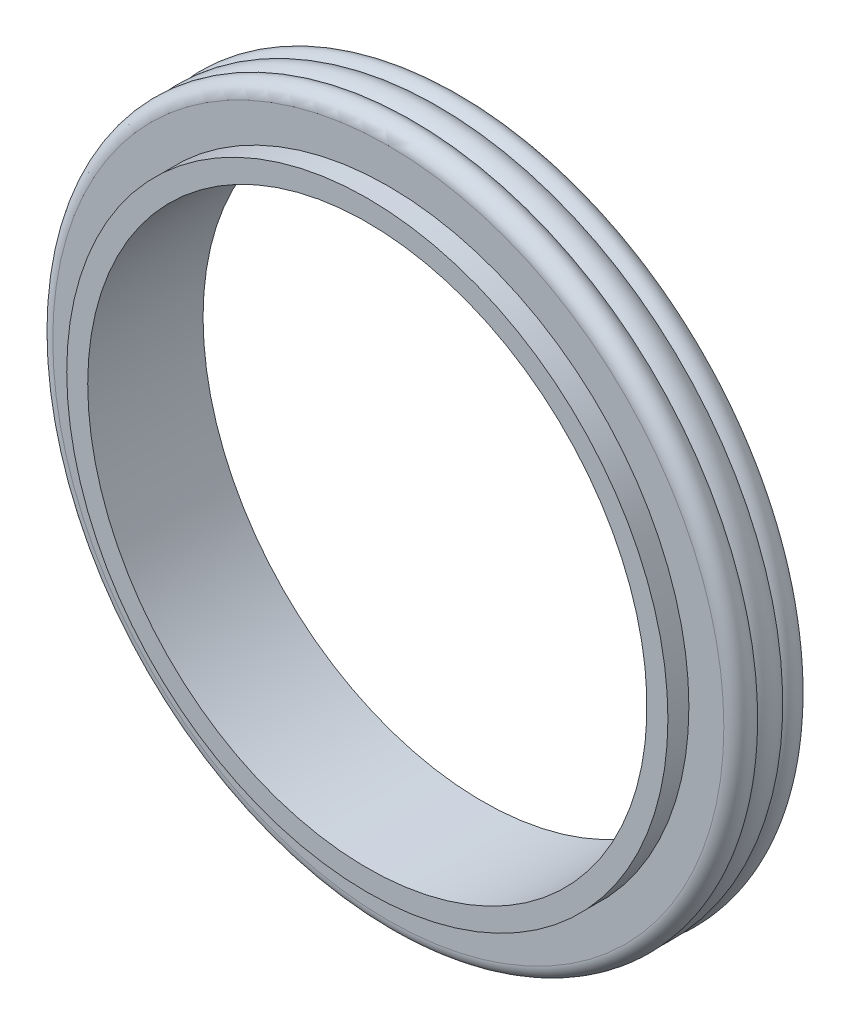
ISO-10303-21;
HEADER;
FILE_DESCRIPTION(('STEP AP214'),'2;1');
FILE_NAME('part.step','',(''),(''),'','','');
FILE_SCHEMA(('AUTOMOTIVE_DESIGN { 1 0 10303 214 1 1 1 1 }'));
ENDSEC;
DATA;
#1=APPLICATION_CONTEXT('core data for automotive mechanical design processes');
#2=APPLICATION_PROTOCOL_DEFINITION('international standard','automotive_design',2000,#1);
#3=PRODUCT_CONTEXT('',#1,'mechanical');
#4=PRODUCT('Part','Part','',(#3));
#5=PRODUCT_RELATED_PRODUCT_CATEGORY('part','',(#4));
#6=PRODUCT_DEFINITION_FORMATION('','',#4);
#7=PRODUCT_DEFINITION_CONTEXT('part definition',#1,'design');
#8=PRODUCT_DEFINITION('design','',#6,#7);
#9=PRODUCT_DEFINITION_SHAPE('','',#8);
#10=(LENGTH_UNIT() NAMED_UNIT(*) SI_UNIT(.MILLI.,.METRE.));
#11=(NAMED_UNIT(*) PLANE_ANGLE_UNIT() SI_UNIT($,.RADIAN.));
#12=(NAMED_UNIT(*) SI_UNIT($,.STERADIAN.) SOLID_ANGLE_UNIT());
#13=UNCERTAINTY_MEASURE_WITH_UNIT(LENGTH_MEASURE(1.E-05),#10,'distance_accuracy_value','');
#14=(GEOMETRIC_REPRESENTATION_CONTEXT(3) GLOBAL_UNCERTAINTY_ASSIGNED_CONTEXT((#13)) GLOBAL_UNIT_ASSIGNED_CONTEXT((#10,
#11,#12)) REPRESENTATION_CONTEXT('',''));
#15=CARTESIAN_POINT('',(0.,0.,0.));
#16=DIRECTION('',(0.,0.,1.));
#17=DIRECTION('',(1.,0.,0.));
#18=AXIS2_PLACEMENT_3D('',#15,#16,#17);
#19=CARTESIAN_POINT('',(0.,40.,8.25));
#20=DIRECTION('',(0.,0.,1.));
#21=DIRECTION('',(1.,0.,0.));
#22=AXIS2_PLACEMENT_3D('',#19,#20,#21);
#23=PLANE('',#22);
#24=CARTESIAN_POINT('',(0.,0.,8.25));
#25=DIRECTION('',(0.,0.,-1.));
#26=DIRECTION('',(-1.,0.,0.));
#27=AXIS2_PLACEMENT_3D('',#24,#25,#26);
#28=CIRCLE('',#27,40.);
#29=CARTESIAN_POINT('',(-40.,0.,8.25));
#30=VERTEX_POINT('',#29);
#31=EDGE_CURVE('E86',#30,#30,#28,.T.);
#32=ORIENTED_EDGE('',*,*,#31,.T.);
#33=EDGE_LOOP('',(#32));
#34=FACE_BOUND('',#33,.T.);
#35=CARTESIAN_POINT('',(0.,0.,8.25));
#36=DIRECTION('',(0.,0.,-1.));
#37=DIRECTION('',(-1.,0.,0.));
#38=AXIS2_PLACEMENT_3D('',#35,#36,#37);
#39=CIRCLE('',#38,43.);
#40=CARTESIAN_POINT('',(-43.,0.,8.25));
#41=VERTEX_POINT('',#40);
#42=EDGE_CURVE('E10',#41,#41,#39,.T.);
#43=ORIENTED_EDGE('',*,*,#42,.F.);
#44=EDGE_LOOP('',(#43));
#45=FACE_BOUND('',#44,.T.);
#46=ADVANCED_FACE('F43',(#34,#45),#23,.T.);
#47=CARTESIAN_POINT('',(0.,0.,0.));
#48=DIRECTION('',(0.,0.,-1.));
#49=DIRECTION('',(-1.,0.,0.));
#50=AXIS2_PLACEMENT_3D('',#47,#48,#49);
#51=CYLINDRICAL_SURFACE('',#50,43.);
#52=ORIENTED_EDGE('',*,*,#42,.T.);
#53=EDGE_LOOP('',(#52));
#54=FACE_BOUND('',#53,.T.);
#55=CARTESIAN_POINT('',(0.,0.,5.25));
#56=DIRECTION('',(0.,0.,-1.));
#57=DIRECTION('',(-1.,0.,0.));
#58=AXIS2_PLACEMENT_3D('',#55,#56,#57);
#59=CIRCLE('',#58,43.);
#60=CARTESIAN_POINT('',(-43.,0.,5.25));
#61=VERTEX_POINT('',#60);
#62=EDGE_CURVE('E50',#61,#61,#59,.T.);
#63=ORIENTED_EDGE('',*,*,#62,.F.);
#64=EDGE_LOOP('',(#63));
#65=FACE_BOUND('',#64,.T.);
#66=ADVANCED_FACE('F105',(#54,#65),#51,.T.);
#67=CARTESIAN_POINT('',(0.,43.,5.25));
#68=DIRECTION('',(0.,0.,1.));
#69=DIRECTION('',(1.,0.,0.));
#70=AXIS2_PLACEMENT_3D('',#67,#68,#69);
#71=PLANE('',#70);
#72=ORIENTED_EDGE('',*,*,#62,.T.);
#73=EDGE_LOOP('',(#72));
#74=FACE_BOUND('',#73,.T.);
#75=CARTESIAN_POINT('',(0.,0.,5.25));
#76=DIRECTION('',(0.,0.,-1.));
#77=DIRECTION('',(-1.,0.,0.));
#78=AXIS2_PLACEMENT_3D('',#75,#76,#77);
#79=CIRCLE('',#78,48.);
#80=CARTESIAN_POINT('',(-48.,0.,5.25));
#81=VERTEX_POINT('',#80);
#82=EDGE_CURVE('E55',#81,#81,#79,.T.);
#83=ORIENTED_EDGE('',*,*,#82,.F.);
#84=EDGE_LOOP('',(#83));
#85=FACE_BOUND('',#84,.T.);
#86=ADVANCED_FACE('F109',(#74,#85),#71,.T.);
#87=CARTESIAN_POINT('',(0.,0.,3.25));
#88=DIRECTION('',(0.,0.,-1.));
#89=DIRECTION('',(-1.,0.,0.));
#90=AXIS2_PLACEMENT_3D('',#87,#88,#89);
#91=TOROIDAL_SURFACE('',#90,48.,2.);
#92=ORIENTED_EDGE('',*,*,#82,.T.);
#93=EDGE_LOOP('',(#92));
#94=FACE_BOUND('',#93,.T.);
#95=CARTESIAN_POINT('',(0.,0.,1.8));
#96=DIRECTION('',(0.,0.,-1.));
#97=DIRECTION('',(-1.,0.,0.));
#98=AXIS2_PLACEMENT_3D('',#95,#96,#97);
#99=CIRCLE('',#98,49.3774977313956);
#100=CARTESIAN_POINT('',(-49.3774977313956,0.,1.8));
#101=VERTEX_POINT('',#100);
#102=EDGE_CURVE('E60',#101,#101,#99,.T.);
#103=ORIENTED_EDGE('',*,*,#102,.F.);
#104=EDGE_LOOP('',(#103));
#105=FACE_BOUND('',#104,.T.);
#106=ADVANCED_FACE('F113',(#94,#105),#91,.T.);
#107=CARTESIAN_POINT('',(0.,0.,0.));
#108=DIRECTION('',(0.,0.,-1.));
#109=DIRECTION('',(-1.,0.,0.));
#110=AXIS2_PLACEMENT_3D('',#107,#108,#109);
#111=TOROIDAL_SURFACE('',#110,46.9774977313956,3.);
#112=ORIENTED_EDGE('',*,*,#102,.T.);
#113=EDGE_LOOP('',(#112));
#114=FACE_BOUND('',#113,.T.);
#115=CARTESIAN_POINT('',(0.,0.,-1.8));
#116=DIRECTION('',(0.,0.,-1.));
#117=DIRECTION('',(-1.,0.,0.));
#118=AXIS2_PLACEMENT_3D('',#115,#116,#117);
#119=CIRCLE('',#118,49.3774977313956);
#120=CARTESIAN_POINT('',(-49.3774977313956,0.,-1.8));
#121=VERTEX_POINT('',#120);
#122=EDGE_CURVE('E66',#121,#121,#119,.T.);
#123=ORIENTED_EDGE('',*,*,#122,.F.);
#124=EDGE_LOOP('',(#123));
#125=FACE_BOUND('',#124,.T.);
#126=ADVANCED_FACE('F119',(#114,#125),#111,.T.);
#127=CARTESIAN_POINT('',(0.,0.,-3.25));
#128=DIRECTION('',(0.,0.,-1.));
#129=DIRECTION('',(-1.,0.,0.));
#130=AXIS2_PLACEMENT_3D('',#127,#128,#129);
#131=TOROIDAL_SURFACE('',#130,48.,2.);
#132=ORIENTED_EDGE('',*,*,#122,.T.);
#133=EDGE_LOOP('',(#132));
#134=FACE_BOUND('',#133,.T.);
#135=CARTESIAN_POINT('',(0.,0.,-5.25));
#136=DIRECTION('',(0.,0.,-1.));
#137=DIRECTION('',(-1.,0.,0.));
#138=AXIS2_PLACEMENT_3D('',#135,#136,#137);
#139=CIRCLE('',#138,48.);
#140=CARTESIAN_POINT('',(-48.,0.,-5.25));
#141=VERTEX_POINT('',#140);
#142=EDGE_CURVE('E70',#141,#141,#139,.T.);
#143=ORIENTED_EDGE('',*,*,#142,.F.);
#144=EDGE_LOOP('',(#143));
#145=FACE_BOUND('',#144,.T.);
#146=ADVANCED_FACE('F123',(#134,#145),#131,.T.);
#147=CARTESIAN_POINT('',(0.,43.,-5.25));
#148=DIRECTION('',(0.,0.,-1.));
#149=DIRECTION('',(-1.,0.,0.));
#150=AXIS2_PLACEMENT_3D('',#147,#148,#149);
#151=PLANE('',#150);
#152=ORIENTED_EDGE('',*,*,#142,.T.);
#153=EDGE_LOOP('',(#152));
#154=FACE_BOUND('',#153,.T.);
#155=CARTESIAN_POINT('',(0.,0.,-5.25));
#156=DIRECTION('',(0.,0.,-1.));
#157=DIRECTION('',(-1.,0.,0.));
#158=AXIS2_PLACEMENT_3D('',#155,#156,#157);
#159=CIRCLE('',#158,43.);
#160=CARTESIAN_POINT('',(-43.,0.,-5.25));
#161=VERTEX_POINT('',#160);
#162=EDGE_CURVE('E74',#161,#161,#159,.T.);
#163=ORIENTED_EDGE('',*,*,#162,.F.);
#164=EDGE_LOOP('',(#163));
#165=FACE_BOUND('',#164,.T.);
#166=ADVANCED_FACE('F127',(#154,#165),#151,.T.);
#167=CARTESIAN_POINT('',(0.,0.,0.));
#168=DIRECTION('',(0.,0.,-1.));
#169=DIRECTION('',(-1.,0.,0.));
#170=AXIS2_PLACEMENT_3D('',#167,#168,#169);
#171=CYLINDRICAL_SURFACE('',#170,43.);
#172=ORIENTED_EDGE('',*,*,#162,.T.);
#173=EDGE_LOOP('',(#172));
#174=FACE_BOUND('',#173,.T.);
#175=CARTESIAN_POINT('',(0.,0.,-8.25));
#176=DIRECTION('',(0.,0.,-1.));
#177=DIRECTION('',(-1.,0.,0.));
#178=AXIS2_PLACEMENT_3D('',#175,#176,#177);
#179=CIRCLE('',#178,43.);
#180=CARTESIAN_POINT('',(-43.,0.,-8.25));
#181=VERTEX_POINT('',#180);
#182=EDGE_CURVE('E78',#181,#181,#179,.T.);
#183=ORIENTED_EDGE('',*,*,#182,.F.);
#184=EDGE_LOOP('',(#183));
#185=FACE_BOUND('',#184,.T.);
#186=ADVANCED_FACE('F101',(#174,#185),#171,.T.);
#187=CARTESIAN_POINT('',(0.,40.,-8.25));
#188=DIRECTION('',(0.,0.,-1.));
#189=DIRECTION('',(-1.,0.,0.));
#190=AXIS2_PLACEMENT_3D('',#187,#188,#189);
#191=PLANE('',#190);
#192=ORIENTED_EDGE('',*,*,#182,.T.);
#193=EDGE_LOOP('',(#192));
#194=FACE_BOUND('',#193,.T.);
#195=CARTESIAN_POINT('',(0.,0.,-8.25));
#196=DIRECTION('',(0.,0.,-1.));
#197=DIRECTION('',(-1.,0.,0.));
#198=AXIS2_PLACEMENT_3D('',#195,#196,#197);
#199=CIRCLE('',#198,40.);
#200=CARTESIAN_POINT('',(-40.,0.,-8.25));
#201=VERTEX_POINT('',#200);
#202=EDGE_CURVE('E82',#201,#201,#199,.T.);
#203=ORIENTED_EDGE('',*,*,#202,.F.);
#204=EDGE_LOOP('',(#203));
#205=FACE_BOUND('',#204,.T.);
#206=ADVANCED_FACE('F95',(#194,#205),#191,.T.);
#207=CARTESIAN_POINT('',(0.,0.,0.));
#208=DIRECTION('',(0.,0.,-1.));
#209=DIRECTION('',(-1.,0.,0.));
#210=AXIS2_PLACEMENT_3D('',#207,#208,#209);
#211=CYLINDRICAL_SURFACE('',#210,40.);
#212=ORIENTED_EDGE('',*,*,#202,.T.);
#213=EDGE_LOOP('',(#212));
#214=FACE_BOUND('',#213,.T.);
#215=ORIENTED_EDGE('',*,*,#31,.F.);
#216=EDGE_LOOP('',(#215));
#217=FACE_BOUND('',#216,.T.);
#218=ADVANCED_FACE('F93',(#214,#217),#211,.F.);
#219=CLOSED_SHELL('',(#46,#66,#86,#106,#126,#146,#166,#186,#206,#218));
#220=MANIFOLD_SOLID_BREP('B2',#219);
#221=ADVANCED_BREP_SHAPE_REPRESENTATION('',(#18,#220),#14);
#222=SHAPE_DEFINITION_REPRESENTATION(#9,#221);
ENDSEC;
END-ISO-10303-21;
